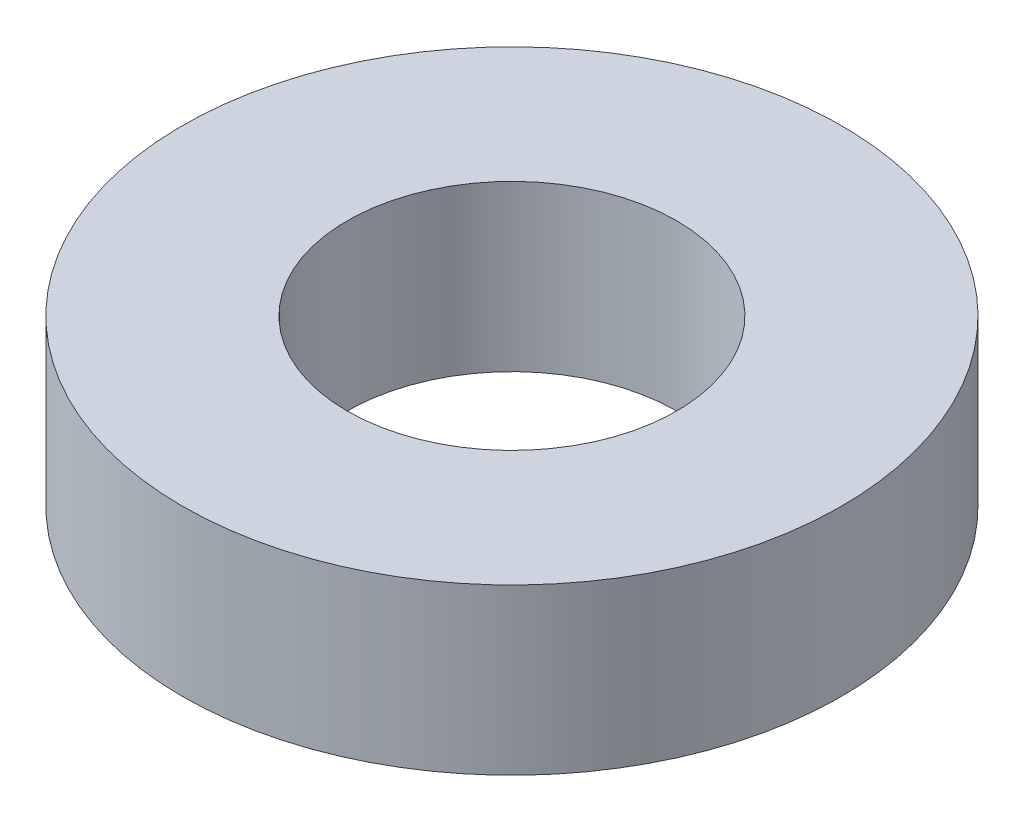
ISO-10303-21;
HEADER;
FILE_DESCRIPTION(('STEP AP214'),'2;1');
FILE_NAME('part.step','',(''),(''),'','','');
FILE_SCHEMA(('AUTOMOTIVE_DESIGN { 1 0 10303 214 1 1 1 1 }'));
ENDSEC;
DATA;
#1=APPLICATION_CONTEXT('core data for automotive mechanical design processes');
#2=APPLICATION_PROTOCOL_DEFINITION('international standard','automotive_design',2000,#1);
#3=PRODUCT_CONTEXT('',#1,'mechanical');
#4=PRODUCT('Part','Part','',(#3));
#5=PRODUCT_RELATED_PRODUCT_CATEGORY('part','',(#4));
#6=PRODUCT_DEFINITION_FORMATION('','',#4);
#7=PRODUCT_DEFINITION_CONTEXT('part definition',#1,'design');
#8=PRODUCT_DEFINITION('design','',#6,#7);
#9=PRODUCT_DEFINITION_SHAPE('','',#8);
#10=(LENGTH_UNIT() NAMED_UNIT(*) SI_UNIT(.MILLI.,.METRE.));
#11=(NAMED_UNIT(*) PLANE_ANGLE_UNIT() SI_UNIT($,.RADIAN.));
#12=(NAMED_UNIT(*) SI_UNIT($,.STERADIAN.) SOLID_ANGLE_UNIT());
#13=UNCERTAINTY_MEASURE_WITH_UNIT(LENGTH_MEASURE(1.E-05),#10,'distance_accuracy_value','');
#14=(GEOMETRIC_REPRESENTATION_CONTEXT(3) GLOBAL_UNCERTAINTY_ASSIGNED_CONTEXT((#13)) GLOBAL_UNIT_ASSIGNED_CONTEXT((#10,
#11,#12)) REPRESENTATION_CONTEXT('',''));
#15=CARTESIAN_POINT('',(0.,0.,0.));
#16=DIRECTION('',(0.,0.,1.));
#17=DIRECTION('',(1.,0.,0.));
#18=AXIS2_PLACEMENT_3D('',#15,#16,#17);
#19=CARTESIAN_POINT('',(0.,50.,0.));
#20=DIRECTION('',(0.,1.,0.));
#21=DIRECTION('',(0.,0.,1.));
#22=AXIS2_PLACEMENT_3D('',#19,#20,#21);
#23=PLANE('',#22);
#24=CARTESIAN_POINT('',(0.,50.,0.));
#25=DIRECTION('',(0.,1.,0.));
#26=DIRECTION('',(0.,0.,1.));
#27=AXIS2_PLACEMENT_3D('',#24,#25,#26);
#28=CIRCLE('',#27,200.);
#29=CARTESIAN_POINT('',(0.,50.,200.));
#30=VERTEX_POINT('',#29);
#31=EDGE_CURVE('E10',#30,#30,#28,.T.);
#32=ORIENTED_EDGE('',*,*,#31,.T.);
#33=EDGE_LOOP('',(#32));
#34=FACE_BOUND('',#33,.T.);
#35=CARTESIAN_POINT('',(0.,50.,0.));
#36=DIRECTION('',(0.,1.,0.));
#37=DIRECTION('',(0.,0.,1.));
#38=AXIS2_PLACEMENT_3D('',#35,#36,#37);
#39=CIRCLE('',#38,100.);
#40=CARTESIAN_POINT('',(0.,50.,100.));
#41=VERTEX_POINT('',#40);
#42=EDGE_CURVE('E45',#41,#41,#39,.T.);
#43=ORIENTED_EDGE('',*,*,#42,.F.);
#44=EDGE_LOOP('',(#43));
#45=FACE_BOUND('',#44,.T.);
#46=ADVANCED_FACE('F34',(#34,#45),#23,.T.);
#47=CARTESIAN_POINT('',(0.,-50.,0.));
#48=DIRECTION('',(0.,1.,0.));
#49=DIRECTION('',(0.,0.,1.));
#50=AXIS2_PLACEMENT_3D('',#47,#48,#49);
#51=PLANE('',#50);
#52=CARTESIAN_POINT('',(0.,-50.,0.));
#53=DIRECTION('',(0.,1.,0.));
#54=DIRECTION('',(0.,0.,1.));
#55=AXIS2_PLACEMENT_3D('',#52,#53,#54);
#56=CIRCLE('',#55,200.);
#57=CARTESIAN_POINT('',(0.,-50.,200.));
#58=VERTEX_POINT('',#57);
#59=EDGE_CURVE('E38',#58,#58,#56,.T.);
#60=ORIENTED_EDGE('',*,*,#59,.F.);
#61=EDGE_LOOP('',(#60));
#62=FACE_BOUND('',#61,.T.);
#63=CARTESIAN_POINT('',(0.,-50.,0.));
#64=DIRECTION('',(0.,1.,0.));
#65=DIRECTION('',(0.,0.,1.));
#66=AXIS2_PLACEMENT_3D('',#63,#64,#65);
#67=CIRCLE('',#66,100.);
#68=CARTESIAN_POINT('',(0.,-50.,100.));
#69=VERTEX_POINT('',#68);
#70=EDGE_CURVE('E47',#69,#69,#67,.T.);
#71=ORIENTED_EDGE('',*,*,#70,.T.);
#72=EDGE_LOOP('',(#71));
#73=FACE_BOUND('',#72,.T.);
#74=ADVANCED_FACE('F57',(#62,#73),#51,.F.);
#75=CARTESIAN_POINT('',(0.,50.,0.));
#76=DIRECTION('',(0.,-1.,0.));
#77=DIRECTION('',(0.,0.,-1.));
#78=AXIS2_PLACEMENT_3D('',#75,#76,#77);
#79=CYLINDRICAL_SURFACE('',#78,200.);
#80=ORIENTED_EDGE('',*,*,#31,.F.);
#81=EDGE_LOOP('',(#80));
#82=FACE_BOUND('',#81,.T.);
#83=ORIENTED_EDGE('',*,*,#59,.T.);
#84=EDGE_LOOP('',(#83));
#85=FACE_BOUND('',#84,.T.);
#86=ADVANCED_FACE('F36',(#82,#85),#79,.T.);
#87=CARTESIAN_POINT('',(0.,50.,0.));
#88=DIRECTION('',(0.,-1.,0.));
#89=DIRECTION('',(0.,0.,-1.));
#90=AXIS2_PLACEMENT_3D('',#87,#88,#89);
#91=CYLINDRICAL_SURFACE('',#90,100.);
#92=ORIENTED_EDGE('',*,*,#42,.T.);
#93=EDGE_LOOP('',(#92));
#94=FACE_BOUND('',#93,.T.);
#95=ORIENTED_EDGE('',*,*,#70,.F.);
#96=EDGE_LOOP('',(#95));
#97=FACE_BOUND('',#96,.T.);
#98=ADVANCED_FACE('F53',(#94,#97),#91,.F.);
#99=CLOSED_SHELL('',(#46,#74,#86,#98));
#100=MANIFOLD_SOLID_BREP('B2',#99);
#101=ADVANCED_BREP_SHAPE_REPRESENTATION('',(#18,#100),#14);
#102=SHAPE_DEFINITION_REPRESENTATION(#9,#101);
ENDSEC;
END-ISO-10303-21;
